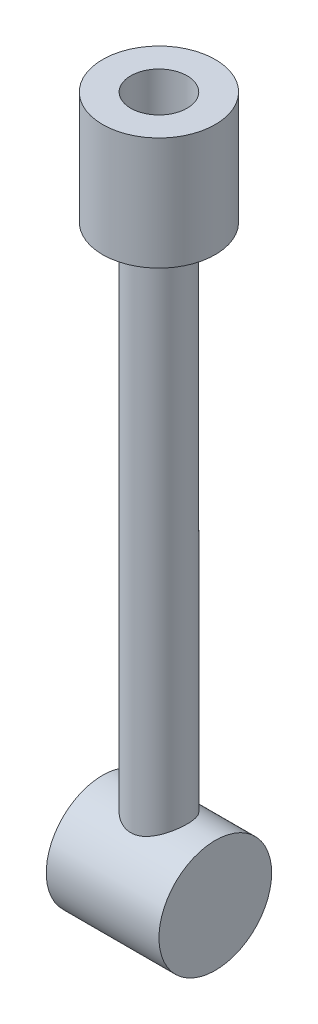
ISO-10303-21;
HEADER;
FILE_DESCRIPTION(('STEP AP214'),'2;1');
FILE_NAME('part.step','',(''),(''),'','','');
FILE_SCHEMA(('AUTOMOTIVE_DESIGN { 1 0 10303 214 1 1 1 1 }'));
ENDSEC;
DATA;
#1=APPLICATION_CONTEXT('core data for automotive mechanical design processes');
#2=APPLICATION_PROTOCOL_DEFINITION('international standard','automotive_design',2000,#1);
#3=PRODUCT_CONTEXT('',#1,'mechanical');
#4=PRODUCT('Part','Part','',(#3));
#5=PRODUCT_RELATED_PRODUCT_CATEGORY('part','',(#4));
#6=PRODUCT_DEFINITION_FORMATION('','',#4);
#7=PRODUCT_DEFINITION_CONTEXT('part definition',#1,'design');
#8=PRODUCT_DEFINITION('design','',#6,#7);
#9=PRODUCT_DEFINITION_SHAPE('','',#8);
#10=(LENGTH_UNIT() NAMED_UNIT(*) SI_UNIT(.MILLI.,.METRE.));
#11=(NAMED_UNIT(*) PLANE_ANGLE_UNIT() SI_UNIT($,.RADIAN.));
#12=(NAMED_UNIT(*) SI_UNIT($,.STERADIAN.) SOLID_ANGLE_UNIT());
#13=UNCERTAINTY_MEASURE_WITH_UNIT(LENGTH_MEASURE(1.E-05),#10,'distance_accuracy_value','');
#14=(GEOMETRIC_REPRESENTATION_CONTEXT(3) GLOBAL_UNCERTAINTY_ASSIGNED_CONTEXT((#13)) GLOBAL_UNIT_ASSIGNED_CONTEXT((#10,
#11,#12)) REPRESENTATION_CONTEXT('',''));
#15=CARTESIAN_POINT('',(0.,0.,0.));
#16=DIRECTION('',(0.,0.,1.));
#17=DIRECTION('',(1.,0.,0.));
#18=AXIS2_PLACEMENT_3D('',#15,#16,#17);
#19=CARTESIAN_POINT('',(50.,0.,0.));
#20=DIRECTION('',(-1.,0.,0.));
#21=DIRECTION('',(0.,0.,1.));
#22=AXIS2_PLACEMENT_3D('',#19,#20,#21);
#23=CYLINDRICAL_SURFACE('',#22,50.);
#24=CARTESIAN_POINT('',(50.,0.,0.));
#25=DIRECTION('',(1.,0.,0.));
#26=DIRECTION('',(0.,0.,-1.));
#27=AXIS2_PLACEMENT_3D('',#24,#25,#26);
#28=CIRCLE('',#27,50.);
#29=CARTESIAN_POINT('',(50.,0.,-50.));
#30=VERTEX_POINT('',#29);
#31=EDGE_CURVE('E42',#30,#30,#28,.T.);
#32=ORIENTED_EDGE('',*,*,#31,.F.);
#33=EDGE_LOOP('',(#32));
#34=FACE_BOUND('',#33,.T.);
#35=CARTESIAN_POINT('',(-50.,0.,0.));
#36=DIRECTION('',(1.,0.,0.));
#37=DIRECTION('',(0.,0.,-1.));
#38=AXIS2_PLACEMENT_3D('',#35,#36,#37);
#39=CIRCLE('',#38,50.);
#40=CARTESIAN_POINT('',(-50.,0.,-50.));
#41=VERTEX_POINT('',#40);
#42=EDGE_CURVE('E46',#41,#41,#39,.T.);
#43=ORIENTED_EDGE('',*,*,#42,.T.);
#44=EDGE_LOOP('',(#43));
#45=FACE_BOUND('',#44,.T.);
#46=CARTESIAN_POINT('',(0.,43.301270189222,-25.));
#47=CARTESIAN_POINT('',(-0.651657728078345,43.3012738974014,-24.9999972492967));
#48=CARTESIAN_POINT('',(-1.30337199528604,43.3160310243838,-24.9744865840936));
#49=CARTESIAN_POINT('',(-2.60177863889863,43.3745117210766,-24.8727781222585));
#50=CARTESIAN_POINT('',(-3.24846853548874,43.4182487761208,-24.7965567281536));
#51=CARTESIAN_POINT('',(-4.53272868796324,43.5331573576326,-24.594261965626));
#52=CARTESIAN_POINT('',(-5.17027999705686,43.6043791614141,-24.4680972258423));
#53=CARTESIAN_POINT('',(-6.43045471544741,43.7716876183493,-24.1675168252073));
#54=CARTESIAN_POINT('',(-7.0530795491345,43.8677718885472,-23.9931057884363));
#55=CARTESIAN_POINT('',(-8.2762885876815,44.0810172919438,-23.599020492088));
#56=CARTESIAN_POINT('',(-8.87697298138665,44.1980627806722,-23.3795936665704));
#57=CARTESIAN_POINT('',(-10.0565840143935,44.450003078188,-22.8969708071432));
#58=CARTESIAN_POINT('',(-10.6355102011031,44.584898258003,-22.6337738633895));
#59=CARTESIAN_POINT('',(-11.7687683585691,44.8687304990091,-22.0657597161742));
#60=CARTESIAN_POINT('',(-12.3231060045315,45.0176642949286,-21.7609521836511));
#61=CARTESIAN_POINT('',(-13.405222067322,45.3258294680467,-21.1115697238676));
#62=CARTESIAN_POINT('',(-13.9329906242587,45.4850646187509,-20.766980187319));
#63=CARTESIAN_POINT('',(-15.0020081204318,45.8233826320238,-20.0100786450758));
#64=CARTESIAN_POINT('',(-15.5407899017115,46.0030202537629,-19.5945268058562));
#65=CARTESIAN_POINT('',(-16.5821820892583,46.365184933611,-18.7214577237365));
#66=CARTESIAN_POINT('',(-17.0847906143755,46.5477121413885,-18.2639383011691));
#67=CARTESIAN_POINT('',(-18.0517317034124,46.9112371384387,-17.3088715339642));
#68=CARTESIAN_POINT('',(-18.5160391270901,47.0922338542697,-16.8112983153376));
#69=CARTESIAN_POINT('',(-19.403358645631,47.4481317438997,-15.778873095701));
#70=CARTESIAN_POINT('',(-19.8263845601862,47.6230349449124,-15.2440336736723));
#71=CARTESIAN_POINT('',(-20.6559103346768,47.9741176674734,-14.101935890209));
#72=CARTESIAN_POINT('',(-21.059348132888,48.1495806286941,-13.4922260925484));
#73=CARTESIAN_POINT('',(-21.8130164090103,48.4839520678334,-12.2363642027715));
#74=CARTESIAN_POINT('',(-22.1632438315922,48.6428595949776,-11.5902100209449));
#75=CARTESIAN_POINT('',(-22.8068723133523,48.9394715219822,-10.2658796175507));
#76=CARTESIAN_POINT('',(-23.1003009240628,49.0771861952305,-9.58771912093295));
#77=CARTESIAN_POINT('',(-23.6271574422266,49.3273633204677,-8.20398216536625));
#78=CARTESIAN_POINT('',(-23.8605917227733,49.4398284545107,-7.49840862763117));
#79=CARTESIAN_POINT('',(-24.2500719399282,49.6290152537626,-6.11654042575089));
#80=CARTESIAN_POINT('',(-24.410441753632,49.7077104710277,-5.44173347042514));
#81=CARTESIAN_POINT('',(-24.6748266692845,49.8380758594528,-4.07858290347346));
#82=CARTESIAN_POINT('',(-24.7788442214104,49.8897472055983,-3.39023988173991));
#83=CARTESIAN_POINT('',(-24.9290995504173,49.9645450119385,-2.0060853632284));
#84=CARTESIAN_POINT('',(-24.9753667718625,49.9876860185287,-1.31027785496802));
#85=CARTESIAN_POINT('',(-25.0095715600164,50.0047839981938,0.0831103975767467));
#86=CARTESIAN_POINT('',(-24.9975126954156,49.9987427567891,0.780691030762013));
#87=CARTESIAN_POINT('',(-24.9188401315975,49.9594597758389,2.11091341143742));
#88=CARTESIAN_POINT('',(-24.8570687182852,49.9286325703957,2.74392012544279));
#89=CARTESIAN_POINT('',(-24.6857933574407,49.8435839162395,4.00180573261866));
#90=CARTESIAN_POINT('',(-24.576292770444,49.789364114565,4.6266851948267));
#91=CARTESIAN_POINT('',(-24.3107512890051,49.6588288150231,5.86411664160767));
#92=CARTESIAN_POINT('',(-24.1547088784611,49.5825125973665,6.47666822390542));
#93=CARTESIAN_POINT('',(-23.7976713405259,49.4095616746076,7.68557846708671));
#94=CARTESIAN_POINT('',(-23.5966745985519,49.3129262397264,8.28193654550032));
#95=CARTESIAN_POINT('',(-23.1485341467428,49.1000532579772,9.46307781020891));
#96=CARTESIAN_POINT('',(-22.9007934938713,48.9835642756784,10.0475888012673));
#97=CARTESIAN_POINT('',(-22.3631542092352,48.7345249487321,11.1932924970822));
#98=CARTESIAN_POINT('',(-22.073255627975,48.6019746233258,11.7544852297725));
#99=CARTESIAN_POINT('',(-21.4533967659483,48.3236126521289,12.8510127622086));
#100=CARTESIAN_POINT('',(-21.1234266116358,48.1777977402037,13.3863411434307));
#101=CARTESIAN_POINT('',(-20.4256190341222,47.8759538475335,14.4287052512528));
#102=CARTESIAN_POINT('',(-20.0577785424352,47.7199240394887,14.9357386800821));
#103=CARTESIAN_POINT('',(-19.2498172622248,47.3857329059287,15.9659829272969));
#104=CARTESIAN_POINT('',(-18.8061507663467,47.2068738780239,16.4861908868765));
#105=CARTESIAN_POINT('',(-17.878545130929,46.845063438937,17.4878151609516));
#106=CARTESIAN_POINT('',(-17.3946036999607,46.6621117953404,17.9692292652126));
#107=CARTESIAN_POINT('',(-16.3884818333071,46.2964642917558,18.8913612335406));
#108=CARTESIAN_POINT('',(-15.8662738391005,46.1137687146198,19.3320492409618));
#109=CARTESIAN_POINT('',(-15.0565544991402,45.843593954014,19.9603840123244));
#110=CARTESIAN_POINT('',(-14.7822362181157,45.7541772399157,20.1643863204588));
#111=CARTESIAN_POINT('',(-14.2249760149928,45.5771884650087,20.5613013775411));
#112=CARTESIAN_POINT('',(-13.942031409767,45.4896169927661,20.7542106211332));
#113=CARTESIAN_POINT('',(-13.0443742119748,45.2196491270857,21.3395295271279));
#114=CARTESIAN_POINT('',(-12.415048704098,45.0415831062526,21.7118230929146));
#115=CARTESIAN_POINT('',(-11.1225584877746,44.7026030694781,22.401452093898));
#116=CARTESIAN_POINT('',(-10.4593967999659,44.5416875264198,22.7187924238286));
#117=CARTESIAN_POINT('',(-9.44266825702121,44.3176563216602,23.1510609956445));
#118=CARTESIAN_POINT('',(-9.1001600119892,44.2458813176477,23.2878388705815));
#119=CARTESIAN_POINT('',(-8.40838786333443,44.1087973854835,23.5464514655133));
#120=CARTESIAN_POINT('',(-8.05912571077179,44.0434868074951,23.6682900002));
#121=CARTESIAN_POINT('',(-7.00201342033253,43.8582674733307,24.0108330854159));
#122=CARTESIAN_POINT('',(-6.2846445728394,43.749027978065,24.2086472902985));
#123=CARTESIAN_POINT('',(-4.88870901344564,43.5713053774777,24.5269620029075));
#124=CARTESIAN_POINT('',(-4.21156873362961,43.5002796598521,24.6523447935619));
#125=CARTESIAN_POINT('',(-2.84669344068969,43.3894151546965,24.8469575763003));
#126=CARTESIAN_POINT('',(-2.15895902852085,43.3495746047735,24.916190741622));
#127=CARTESIAN_POINT('',(-0.77942121257122,43.3028003096564,24.9973937987513));
#128=CARTESIAN_POINT('',(-0.0876205201857594,43.2958466843242,25.0093982853171));
#129=CARTESIAN_POINT('',(1.29410670579055,43.3150972499872,24.9760435062342));
#130=CARTESIAN_POINT('',(1.98403336273574,43.3412992028497,24.9306881126047));
#131=CARTESIAN_POINT('',(3.2805525639814,43.4210793380396,24.7914377927162));
#132=CARTESIAN_POINT('',(3.88799241923915,43.4713430273842,24.7034064080223));
#133=CARTESIAN_POINT('',(5.09235719600755,43.5955661816634,24.4835158457237));
#134=CARTESIAN_POINT('',(5.68928304348069,43.66952354879,24.3516605481936));
#135=CARTESIAN_POINT('',(6.86915997755549,43.8388445712505,24.0455037172597));
#136=CARTESIAN_POINT('',(7.45210761033612,43.9342134579594,23.8711918097489));
#137=CARTESIAN_POINT('',(8.6007779677829,44.1435654387754,23.4817897713769));
#138=CARTESIAN_POINT('',(9.16649963911454,44.2575496684739,23.2666971526418));
#139=CARTESIAN_POINT('',(10.3036310513174,44.5066624984352,22.7866934178469));
#140=CARTESIAN_POINT('',(10.8741040265233,44.6425228592292,22.5199449130062));
#141=CARTESIAN_POINT('',(11.9909294700445,44.9276158962727,21.9456625079577));
#142=CARTESIAN_POINT('',(12.5372714883265,45.0768542828119,21.6381111642824));
#143=CARTESIAN_POINT('',(13.6034940304572,45.3849587766745,20.9841879069052));
#144=CARTESIAN_POINT('',(14.1233692262792,45.543826808548,20.6378082212681));
#145=CARTESIAN_POINT('',(15.1345879150036,45.8674857084529,19.9081156666699));
#146=CARTESIAN_POINT('',(15.625929372136,46.032276997731,19.5248001676595));
#147=CARTESIAN_POINT('',(16.6383010122431,46.3851314469512,18.6723933753344));
#148=CARTESIAN_POINT('',(17.1552571745104,46.5735078682781,18.1985814957771));
#149=CARTESIAN_POINT('',(18.1479612677743,46.9482395083492,17.208801457832));
#150=CARTESIAN_POINT('',(18.6237060214299,47.1345945702822,16.6928300549538));
#151=CARTESIAN_POINT('',(19.5313825427206,47.5005510327761,15.6210867099589));
#152=CARTESIAN_POINT('',(19.9632988201806,47.6801500315453,15.0653008138923));
#153=CARTESIAN_POINT('',(20.78021650138,48.0279167170746,13.9168654136766));
#154=CARTESIAN_POINT('',(21.1652183667226,48.1960845163019,13.324216272321));
#155=CARTESIAN_POINT('',(21.8948385164209,48.5208655173557,12.0890056860871));
#156=CARTESIAN_POINT('',(22.2381140666933,48.6770536851778,11.445537083859));
#157=CARTESIAN_POINT('',(22.8686774667118,48.9683386405049,10.1270695634352));
#158=CARTESIAN_POINT('',(23.1559634400449,49.1034347211076,9.45206958944887));
#159=CARTESIAN_POINT('',(23.6710809469709,49.3484422850348,8.07584855033876));
#160=CARTESIAN_POINT('',(23.8989549518689,49.4583717521001,7.37464662821719));
#161=CARTESIAN_POINT('',(24.2925476674675,49.6497556882263,5.9512332801707));
#162=CARTESIAN_POINT('',(24.458273748637,49.7312135338177,5.2290243565372));
#163=CARTESIAN_POINT('',(24.7129738270469,49.8569959046632,3.83701251064257));
#164=CARTESIAN_POINT('',(24.8075966684247,49.9040426202125,3.16848428122954));
#165=CARTESIAN_POINT('',(24.9424667472851,49.9712236366137,1.82462999197065));
#166=CARTESIAN_POINT('',(24.9827174357542,49.9913596454803,1.14930436629496));
#167=CARTESIAN_POINT('',(25.0083162364952,50.0041574921416,-0.202439854909063));
#168=CARTESIAN_POINT('',(24.9936807058504,49.996827515296,-0.878858064769209));
#169=CARTESIAN_POINT('',(24.9097358222379,49.9549157470231,-2.22742891911759));
#170=CARTESIAN_POINT('',(24.8404279743976,49.9203347058167,-2.89958168052));
#171=CARTESIAN_POINT('',(24.6543998024786,49.8280383988319,-4.19012849545485));
#172=CARTESIAN_POINT('',(24.5411116057829,49.7720011161013,-4.80914210853197));
#173=CARTESIAN_POINT('',(24.2688562352993,49.638325111347,-6.03461366863558));
#174=CARTESIAN_POINT('',(24.109891640303,49.5606876088334,-6.64107232241654));
#175=CARTESIAN_POINT('',(23.747849994662,49.3855777801893,-7.83775931737804));
#176=CARTESIAN_POINT('',(23.5447695147136,49.2881039121362,-8.42798639279271));
#177=CARTESIAN_POINT('',(23.0963397362171,49.0754720301766,-9.58886482620042));
#178=CARTESIAN_POINT('',(22.8509884649227,48.9603131909529,-10.1595152690755));
#179=CARTESIAN_POINT('',(22.308659364884,48.7095065616211,-11.3022392748832));
#180=CARTESIAN_POINT('',(22.0099237661831,48.5731936311759,-11.8733321215653));
#181=CARTESIAN_POINT('',(21.3709751726378,48.2870272685357,-12.9882367601858));
#182=CARTESIAN_POINT('',(21.030761401556,48.1371735829479,-13.5320480412983));
#183=CARTESIAN_POINT('',(20.3110145040853,47.82710328795,-14.5901418631954));
#184=CARTESIAN_POINT('',(19.9314678829648,47.6668831290299,-15.1044141747537));
#185=CARTESIAN_POINT('',(19.135326866118,47.3395085084327,-16.1011229628171));
#186=CARTESIAN_POINT('',(18.7187291259197,47.1723534214926,-16.5835565584942));
#187=CARTESIAN_POINT('',(17.8073460558901,46.8178193567662,-17.5609868614201));
#188=CARTESIAN_POINT('',(17.3089057811131,46.6300838004161,-18.0524521311882));
#189=CARTESIAN_POINT('',(16.2724114852239,46.2553556901095,-18.9920498989603));
#190=CARTESIAN_POINT('',(15.7343545615363,46.0683631916544,-19.4401792163128));
#191=CARTESIAN_POINT('',(14.6207785923102,45.7000088573962,-20.2909910624585));
#192=CARTESIAN_POINT('',(14.0452252134736,45.5186524130989,-20.6936309903305));
#193=CARTESIAN_POINT('',(12.859787725171,45.1669568158024,-21.4504110417563));
#194=CARTESIAN_POINT('',(12.2499062502337,44.9966168194903,-21.8045548800276));
#195=CARTESIAN_POINT('',(11.3018607185228,44.7508086460529,-22.3024856266454));
#196=CARTESIAN_POINT('',(10.9750333120999,44.6693211671637,-22.4651334968817));
#197=CARTESIAN_POINT('',(10.3136429723918,44.5114376206163,-22.7763547859923));
#198=CARTESIAN_POINT('',(9.97908184493879,44.4350403802383,-22.9249314500231));
#199=CARTESIAN_POINT('',(8.96426144522224,44.2145039056118,-23.3490772961765));
#200=CARTESIAN_POINT('',(8.2728835951333,44.0790247669708,-23.6030526309905));
#201=CARTESIAN_POINT('',(6.86794293612769,43.8370978970742,-24.0493909122374));
#202=CARTESIAN_POINT('',(6.15445136020553,43.7305659487763,-24.2419328799137));
#203=CARTESIAN_POINT('',(4.70954394909072,43.5507401419656,-24.5635340961408));
#204=CARTESIAN_POINT('',(3.97814102285206,43.4774230473757,-24.6926377295426));
#205=CARTESIAN_POINT('',(2.70500982979901,43.3823768905292,-24.8591156657607));
#206=CARTESIAN_POINT('',(2.16587885060814,43.3520358806036,-24.91189663269));
#207=CARTESIAN_POINT('',(1.08451176835221,43.3114803138655,-24.9823411189456));
#208=CARTESIAN_POINT('',(0.542275459994336,43.301267103469,-25.0000022889913));
#209=CARTESIAN_POINT('',(0.,43.301270189222,-25.));
#210=B_SPLINE_CURVE_WITH_KNOTS('',3,(#46,#47,#48,#49,#50,#51,#52,#53,#54,#55,#56,#57,#58,#59,
#60,#61,#62,#63,#64,#65,#66,#67,#68,#69,#70,#71,#72,#73,#74,#75,#76,#77,#78,#79,#80,#81,#82,#83,
#84,#85,#86,#87,#88,#89,#90,#91,#92,#93,#94,#95,#96,#97,#98,#99,#100,#101,#102,#103,#104,#105,
#106,#107,#108,#109,#110,#111,#112,#113,#114,#115,#116,#117,#118,#119,#120,#121,#122,#123,#124,
#125,#126,#127,#128,#129,#130,#131,#132,#133,#134,#135,#136,#137,#138,#139,#140,#141,#142,#143,
#144,#145,#146,#147,#148,#149,#150,#151,#152,#153,#154,#155,#156,#157,#158,#159,#160,#161,#162,
#163,#164,#165,#166,#167,#168,#169,#170,#171,#172,#173,#174,#175,#176,#177,#178,#179,#180,#181,
#182,#183,#184,#185,#186,#187,#188,#189,#190,#191,#192,#193,#194,#195,#196,#197,#198,#199,#200,
#201,#202,#203,#204,#205,#206,#207,#208,#209),.UNSPECIFIED.,.T.,.F.,(4,2,2,2,2,2,2,2,2,2,2,2,2,
2,2,2,2,2,2,2,2,2,2,2,2,2,2,2,2,2,2,2,2,2,2,2,2,2,2,2,2,2,2,2,2,2,2,2,2,2,2,2,2,2,2,2,2,2,2,2,2,
2,2,2,2,2,2,2,2,2,2,2,2,2,2,2,2,2,2,2,2,4),(0.,1.95441192278272,3.90973393836879,
5.86864987236744,7.8273781225633,9.77561538455969,11.723893149394,13.6717188730885,
15.620262192923,17.7292201070748,19.8382876161037,21.9487286473746,24.0584607311283,
26.3111473362998,28.5639632414418,30.8156836143288,33.067164691916,35.1584826548101,
37.2497096806103,39.339870037992,41.4299025102114,43.3379272290007,45.2458176284876,
47.153770184371,49.0617912774175,50.9960675392925,52.9303414839626,54.8650930001226,
56.8000014052271,58.917848189163,61.0358155497571,63.1553234931732,64.2151556831173,
65.2753209551759,67.5299925667647,69.7844632493247,70.9112804180446,72.0378092573376,
74.2902273803598,76.3642610710997,78.4381775418091,80.5108401701136,82.5833628929462,
84.4287799170669,86.2740335954544,88.1197386074929,89.9655562551281,91.8963352398348,
93.8279423204728,95.7599367269954,97.6920688048029,99.8679420645493,102.043982932003,
104.220790212283,106.39757607266,108.632125578475,110.866749959239,113.099772486652,
115.332530103652,117.360339064742,119.388019315274,121.415095328543,123.442115538416,
125.335316614567,127.228410825634,129.121652247157,131.014982048795,132.989197931268,
134.9634507656,136.938383204219,138.913494094206,141.085252835438,143.257170852589,
145.431106304714,147.604875143848,148.726679825932,149.848225159809,152.091379766987,
154.327936660809,156.562926503801,158.1891770497,159.815536377274),.UNSPECIFIED.);
#211=CARTESIAN_POINT('',(0.,43.301270189222,-25.));
#212=VERTEX_POINT('',#211);
#213=EDGE_CURVE('E10',#212,#212,#210,.T.);
#214=ORIENTED_EDGE('',*,*,#213,.F.);
#215=EDGE_LOOP('',(#214));
#216=FACE_BOUND('',#215,.T.);
#217=ADVANCED_FACE('F31',(#34,#45,#216),#23,.T.);
#218=CARTESIAN_POINT('',(50.,0.,0.));
#219=DIRECTION('',(1.,0.,0.));
#220=DIRECTION('',(0.,0.,-1.));
#221=AXIS2_PLACEMENT_3D('',#218,#219,#220);
#222=PLANE('',#221);
#223=ORIENTED_EDGE('',*,*,#31,.T.);
#224=EDGE_LOOP('',(#223));
#225=FACE_BOUND('',#224,.T.);
#226=ADVANCED_FACE('F96',(#225),#222,.T.);
#227=CARTESIAN_POINT('',(-50.,0.,0.));
#228=DIRECTION('',(1.,0.,0.));
#229=DIRECTION('',(0.,0.,-1.));
#230=AXIS2_PLACEMENT_3D('',#227,#228,#229);
#231=PLANE('',#230);
#232=ORIENTED_EDGE('',*,*,#42,.F.);
#233=EDGE_LOOP('',(#232));
#234=FACE_BOUND('',#233,.T.);
#235=ADVANCED_FACE('F101',(#234),#231,.F.);
#236=CARTESIAN_POINT('',(0.,500.,0.));
#237=DIRECTION('',(0.,-1.,0.));
#238=DIRECTION('',(0.,0.,-1.));
#239=AXIS2_PLACEMENT_3D('',#236,#237,#238);
#240=CYLINDRICAL_SURFACE('',#239,25.);
#241=CARTESIAN_POINT('',(0.,500.,0.));
#242=DIRECTION('',(0.,1.,0.));
#243=DIRECTION('',(0.,0.,1.));
#244=AXIS2_PLACEMENT_3D('',#241,#242,#243);
#245=CIRCLE('',#244,25.);
#246=CARTESIAN_POINT('',(0.,500.,25.));
#247=VERTEX_POINT('',#246);
#248=EDGE_CURVE('E51',#247,#247,#245,.T.);
#249=ORIENTED_EDGE('',*,*,#248,.F.);
#250=EDGE_LOOP('',(#249));
#251=FACE_BOUND('',#250,.T.);
#252=ORIENTED_EDGE('',*,*,#213,.T.);
#253=EDGE_LOOP('',(#252));
#254=FACE_BOUND('',#253,.T.);
#255=ADVANCED_FACE('F86',(#251,#254),#240,.T.);
#256=CARTESIAN_POINT('',(0.,600.,0.));
#257=DIRECTION('',(0.,-1.,0.));
#258=DIRECTION('',(0.,0.,-1.));
#259=AXIS2_PLACEMENT_3D('',#256,#257,#258);
#260=CYLINDRICAL_SURFACE('',#259,50.);
#261=CARTESIAN_POINT('',(0.,600.,0.));
#262=DIRECTION('',(0.,1.,0.));
#263=DIRECTION('',(0.,0.,1.));
#264=AXIS2_PLACEMENT_3D('',#261,#262,#263);
#265=CIRCLE('',#264,50.);
#266=CARTESIAN_POINT('',(0.,600.,50.));
#267=VERTEX_POINT('',#266);
#268=EDGE_CURVE('E55',#267,#267,#265,.T.);
#269=ORIENTED_EDGE('',*,*,#268,.F.);
#270=EDGE_LOOP('',(#269));
#271=FACE_BOUND('',#270,.T.);
#272=CARTESIAN_POINT('',(0.,500.,0.));
#273=DIRECTION('',(0.,1.,0.));
#274=DIRECTION('',(0.,0.,1.));
#275=AXIS2_PLACEMENT_3D('',#272,#273,#274);
#276=CIRCLE('',#275,50.);
#277=CARTESIAN_POINT('',(0.,500.,50.));
#278=VERTEX_POINT('',#277);
#279=EDGE_CURVE('E56',#278,#278,#276,.T.);
#280=ORIENTED_EDGE('',*,*,#279,.T.);
#281=EDGE_LOOP('',(#280));
#282=FACE_BOUND('',#281,.T.);
#283=ADVANCED_FACE('F80',(#271,#282),#260,.T.);
#284=CARTESIAN_POINT('',(0.,600.,0.));
#285=DIRECTION('',(0.,1.,0.));
#286=DIRECTION('',(0.,0.,1.));
#287=AXIS2_PLACEMENT_3D('',#284,#285,#286);
#288=PLANE('',#287);
#289=CARTESIAN_POINT('',(0.,600.,0.));
#290=DIRECTION('',(0.,1.,0.));
#291=DIRECTION('',(0.,0.,1.));
#292=AXIS2_PLACEMENT_3D('',#289,#290,#291);
#293=CIRCLE('',#292,25.);
#294=CARTESIAN_POINT('',(0.,600.,25.));
#295=VERTEX_POINT('',#294);
#296=EDGE_CURVE('E62',#295,#295,#293,.T.);
#297=ORIENTED_EDGE('',*,*,#296,.F.);
#298=EDGE_LOOP('',(#297));
#299=FACE_BOUND('',#298,.T.);
#300=ORIENTED_EDGE('',*,*,#268,.T.);
#301=EDGE_LOOP('',(#300));
#302=FACE_BOUND('',#301,.T.);
#303=ADVANCED_FACE('F77',(#299,#302),#288,.T.);
#304=CARTESIAN_POINT('',(0.,500.,0.));
#305=DIRECTION('',(0.,1.,0.));
#306=DIRECTION('',(0.,0.,1.));
#307=AXIS2_PLACEMENT_3D('',#304,#305,#306);
#308=PLANE('',#307);
#309=ORIENTED_EDGE('',*,*,#248,.T.);
#310=EDGE_LOOP('',(#309));
#311=FACE_BOUND('',#310,.T.);
#312=ORIENTED_EDGE('',*,*,#279,.F.);
#313=EDGE_LOOP('',(#312));
#314=FACE_BOUND('',#313,.T.);
#315=ADVANCED_FACE('F73',(#311,#314),#308,.F.);
#316=CARTESIAN_POINT('',(0.,550.,0.));
#317=DIRECTION('',(0.,1.,0.));
#318=DIRECTION('',(0.,0.,1.));
#319=AXIS2_PLACEMENT_3D('',#316,#317,#318);
#320=CYLINDRICAL_SURFACE('',#319,25.);
#321=CARTESIAN_POINT('',(0.,550.,0.));
#322=DIRECTION('',(0.,1.,0.));
#323=DIRECTION('',(0.,0.,1.));
#324=AXIS2_PLACEMENT_3D('',#321,#322,#323);
#325=CIRCLE('',#324,25.);
#326=CARTESIAN_POINT('',(0.,550.,25.));
#327=VERTEX_POINT('',#326);
#328=EDGE_CURVE('E59',#327,#327,#325,.T.);
#329=ORIENTED_EDGE('',*,*,#328,.F.);
#330=EDGE_LOOP('',(#329));
#331=FACE_BOUND('',#330,.T.);
#332=ORIENTED_EDGE('',*,*,#296,.T.);
#333=EDGE_LOOP('',(#332));
#334=FACE_BOUND('',#333,.T.);
#335=ADVANCED_FACE('F70',(#331,#334),#320,.F.);
#336=CARTESIAN_POINT('',(0.,550.,0.));
#337=DIRECTION('',(0.,1.,0.));
#338=DIRECTION('',(0.,0.,1.));
#339=AXIS2_PLACEMENT_3D('',#336,#337,#338);
#340=PLANE('',#339);
#341=ORIENTED_EDGE('',*,*,#328,.T.);
#342=EDGE_LOOP('',(#341));
#343=FACE_BOUND('',#342,.T.);
#344=ADVANCED_FACE('F68',(#343),#340,.T.);
#345=CLOSED_SHELL('',(#217,#226,#235,#255,#283,#303,#315,#335,#344));
#346=MANIFOLD_SOLID_BREP('B2',#345);
#347=ADVANCED_BREP_SHAPE_REPRESENTATION('',(#18,#346),#14);
#348=SHAPE_DEFINITION_REPRESENTATION(#9,#347);
ENDSEC;
END-ISO-10303-21;
